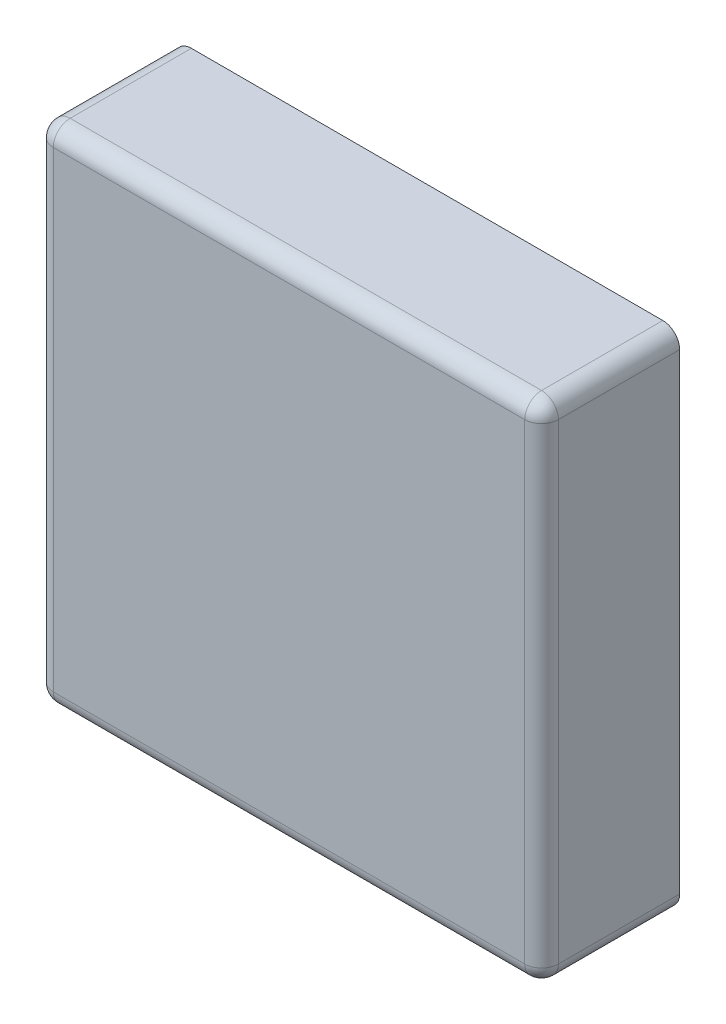
ISO-10303-21;
HEADER;
FILE_DESCRIPTION(('STEP AP214'),'2;1');
FILE_NAME('part.step','',(''),(''),'','','');
FILE_SCHEMA(('AUTOMOTIVE_DESIGN { 1 0 10303 214 1 1 1 1 }'));
ENDSEC;
DATA;
#1=APPLICATION_CONTEXT('core data for automotive mechanical design processes');
#2=APPLICATION_PROTOCOL_DEFINITION('international standard','automotive_design',2000,#1);
#3=PRODUCT_CONTEXT('',#1,'mechanical');
#4=PRODUCT('Part','Part','',(#3));
#5=PRODUCT_RELATED_PRODUCT_CATEGORY('part','',(#4));
#6=PRODUCT_DEFINITION_FORMATION('','',#4);
#7=PRODUCT_DEFINITION_CONTEXT('part definition',#1,'design');
#8=PRODUCT_DEFINITION('design','',#6,#7);
#9=PRODUCT_DEFINITION_SHAPE('','',#8);
#10=(LENGTH_UNIT() NAMED_UNIT(*) SI_UNIT(.MILLI.,.METRE.));
#11=(NAMED_UNIT(*) PLANE_ANGLE_UNIT() SI_UNIT($,.RADIAN.));
#12=(NAMED_UNIT(*) SI_UNIT($,.STERADIAN.) SOLID_ANGLE_UNIT());
#13=UNCERTAINTY_MEASURE_WITH_UNIT(LENGTH_MEASURE(1.E-05),#10,'distance_accuracy_value','');
#14=(GEOMETRIC_REPRESENTATION_CONTEXT(3) GLOBAL_UNCERTAINTY_ASSIGNED_CONTEXT((#13)) GLOBAL_UNIT_ASSIGNED_CONTEXT((#10,
#11,#12)) REPRESENTATION_CONTEXT('',''));
#15=CARTESIAN_POINT('',(0.,0.,0.));
#16=DIRECTION('',(0.,0.,1.));
#17=DIRECTION('',(1.,0.,0.));
#18=AXIS2_PLACEMENT_3D('',#15,#16,#17);
#19=CARTESIAN_POINT('',(-1.5,-1.5,0.));
#20=DIRECTION('',(0.,-1.,0.));
#21=DIRECTION('',(0.,0.,-1.));
#22=AXIS2_PLACEMENT_3D('',#19,#20,#21);
#23=PLANE('',#22);
#24=DIRECTION('',(0.,0.,1.));
#25=VECTOR('',#24,1.);
#26=CARTESIAN_POINT('',(-1.4,-1.5,0.));
#27=LINE('',#26,#25);
#28=CARTESIAN_POINT('',(-1.4,-1.5,0.));
#29=VERTEX_POINT('',#28);
#30=CARTESIAN_POINT('',(-1.4,-1.5,0.72));
#31=VERTEX_POINT('',#30);
#32=EDGE_CURVE('E141',#29,#31,#27,.T.);
#33=ORIENTED_EDGE('',*,*,#32,.F.);
#34=DIRECTION('',(1.,0.,0.));
#35=VECTOR('',#34,1.);
#36=CARTESIAN_POINT('',(-1.5,-1.5,0.));
#37=LINE('',#36,#35);
#38=CARTESIAN_POINT('',(1.4,-1.5,0.));
#39=VERTEX_POINT('',#38);
#40=EDGE_CURVE('E11',#29,#39,#37,.T.);
#41=ORIENTED_EDGE('',*,*,#40,.T.);
#42=DIRECTION('',(0.,0.,-1.));
#43=VECTOR('',#42,1.);
#44=CARTESIAN_POINT('',(1.4,-1.5,0.));
#45=LINE('',#44,#43);
#46=CARTESIAN_POINT('',(1.4,-1.5,0.72));
#47=VERTEX_POINT('',#46);
#48=EDGE_CURVE('E190',#47,#39,#45,.T.);
#49=ORIENTED_EDGE('',*,*,#48,.F.);
#50=DIRECTION('',(1.,0.,0.));
#51=VECTOR('',#50,1.);
#52=CARTESIAN_POINT('',(-0.75,-1.5,0.72));
#53=LINE('',#52,#51);
#54=EDGE_CURVE('E168',#31,#47,#53,.T.);
#55=ORIENTED_EDGE('',*,*,#54,.F.);
#56=EDGE_LOOP('',(#33,#41,#49,#55));
#57=FACE_BOUND('',#56,.T.);
#58=ADVANCED_FACE('F16',(#57),#23,.T.);
#59=CARTESIAN_POINT('',(1.5,-1.5,0.));
#60=DIRECTION('',(1.,0.,0.));
#61=DIRECTION('',(0.,1.,0.));
#62=AXIS2_PLACEMENT_3D('',#59,#60,#61);
#63=PLANE('',#62);
#64=DIRECTION('',(0.,0.,1.));
#65=VECTOR('',#64,1.);
#66=CARTESIAN_POINT('',(1.5,-1.4,0.));
#67=LINE('',#66,#65);
#68=CARTESIAN_POINT('',(1.5,-1.4,0.));
#69=VERTEX_POINT('',#68);
#70=CARTESIAN_POINT('',(1.5,-1.4,0.72));
#71=VERTEX_POINT('',#70);
#72=EDGE_CURVE('E186',#69,#71,#67,.T.);
#73=ORIENTED_EDGE('',*,*,#72,.F.);
#74=DIRECTION('',(0.,1.,0.));
#75=VECTOR('',#74,1.);
#76=CARTESIAN_POINT('',(1.5,-1.5,0.));
#77=LINE('',#76,#75);
#78=CARTESIAN_POINT('',(1.5,1.4,0.));
#79=VERTEX_POINT('',#78);
#80=EDGE_CURVE('E27',#69,#79,#77,.T.);
#81=ORIENTED_EDGE('',*,*,#80,.T.);
#82=DIRECTION('',(0.,0.,-1.));
#83=VECTOR('',#82,1.);
#84=CARTESIAN_POINT('',(1.5,1.4,0.));
#85=LINE('',#84,#83);
#86=CARTESIAN_POINT('',(1.5,1.4,0.72));
#87=VERTEX_POINT('',#86);
#88=EDGE_CURVE('E197',#87,#79,#85,.T.);
#89=ORIENTED_EDGE('',*,*,#88,.F.);
#90=DIRECTION('',(0.,1.,0.));
#91=VECTOR('',#90,1.);
#92=CARTESIAN_POINT('',(1.5,-0.75,0.72));
#93=LINE('',#92,#91);
#94=EDGE_CURVE('E249',#71,#87,#93,.T.);
#95=ORIENTED_EDGE('',*,*,#94,.F.);
#96=EDGE_LOOP('',(#73,#81,#89,#95));
#97=FACE_BOUND('',#96,.T.);
#98=ADVANCED_FACE('F356',(#97),#63,.T.);
#99=CARTESIAN_POINT('',(0.,0.,0.82));
#100=DIRECTION('',(0.,0.,1.));
#101=DIRECTION('',(1.,0.,0.));
#102=AXIS2_PLACEMENT_3D('',#99,#100,#101);
#103=PLANE('',#102);
#104=DIRECTION('',(0.,1.,0.));
#105=VECTOR('',#104,1.);
#106=CARTESIAN_POINT('',(-1.4,0.75,0.82));
#107=LINE('',#106,#105);
#108=CARTESIAN_POINT('',(-1.4,-1.4,0.82));
#109=VERTEX_POINT('',#108);
#110=CARTESIAN_POINT('',(-1.4,1.4,0.82));
#111=VERTEX_POINT('',#110);
#112=EDGE_CURVE('E129',#109,#111,#107,.T.);
#113=ORIENTED_EDGE('',*,*,#112,.F.);
#114=DIRECTION('',(-1.,0.,0.));
#115=VECTOR('',#114,1.);
#116=CARTESIAN_POINT('',(-0.75,-1.4,0.82));
#117=LINE('',#116,#115);
#118=CARTESIAN_POINT('',(1.4,-1.4,0.82));
#119=VERTEX_POINT('',#118);
#120=EDGE_CURVE('E171',#119,#109,#117,.T.);
#121=ORIENTED_EDGE('',*,*,#120,.F.);
#122=DIRECTION('',(0.,-1.,0.));
#123=VECTOR('',#122,1.);
#124=CARTESIAN_POINT('',(1.4,-0.75,0.82));
#125=LINE('',#124,#123);
#126=CARTESIAN_POINT('',(1.4,1.4,0.82));
#127=VERTEX_POINT('',#126);
#128=EDGE_CURVE('E20',#127,#119,#125,.T.);
#129=ORIENTED_EDGE('',*,*,#128,.F.);
#130=DIRECTION('',(1.,0.,0.));
#131=VECTOR('',#130,1.);
#132=CARTESIAN_POINT('',(0.75,1.4,0.82));
#133=LINE('',#132,#131);
#134=EDGE_CURVE('E201',#111,#127,#133,.T.);
#135=ORIENTED_EDGE('',*,*,#134,.F.);
#136=EDGE_LOOP('',(#113,#121,#129,#135));
#137=FACE_BOUND('',#136,.T.);
#138=ADVANCED_FACE('F351',(#137),#103,.T.);
#139=CARTESIAN_POINT('',(0.,0.,0.));
#140=DIRECTION('',(0.,0.,1.));
#141=DIRECTION('',(1.,0.,0.));
#142=AXIS2_PLACEMENT_3D('',#139,#140,#141);
#143=PLANE('',#142);
#144=CARTESIAN_POINT('',(-1.4,-1.4,0.));
#145=DIRECTION('',(0.,0.,1.));
#146=DIRECTION('',(-0.707106781186548,-0.707106781186548,0.));
#147=AXIS2_PLACEMENT_3D('',#144,#145,#146);
#148=CIRCLE('',#147,0.1);
#149=CARTESIAN_POINT('',(-1.5,-1.4,0.));
#150=VERTEX_POINT('',#149);
#151=EDGE_CURVE('E193',#150,#29,#148,.T.);
#152=ORIENTED_EDGE('',*,*,#151,.F.);
#153=DIRECTION('',(0.,-1.,0.));
#154=VECTOR('',#153,1.);
#155=CARTESIAN_POINT('',(-1.5,1.5,0.));
#156=LINE('',#155,#154);
#157=CARTESIAN_POINT('',(-1.5,1.4,0.));
#158=VERTEX_POINT('',#157);
#159=EDGE_CURVE('E135',#158,#150,#156,.T.);
#160=ORIENTED_EDGE('',*,*,#159,.F.);
#161=CARTESIAN_POINT('',(-1.4,1.4,0.));
#162=DIRECTION('',(0.,0.,1.));
#163=DIRECTION('',(-0.707106781186548,0.707106781186548,0.));
#164=AXIS2_PLACEMENT_3D('',#161,#162,#163);
#165=CIRCLE('',#164,0.1);
#166=CARTESIAN_POINT('',(-1.4,1.5,0.));
#167=VERTEX_POINT('',#166);
#168=EDGE_CURVE('E211',#167,#158,#165,.T.);
#169=ORIENTED_EDGE('',*,*,#168,.F.);
#170=DIRECTION('',(-1.,0.,0.));
#171=VECTOR('',#170,1.);
#172=CARTESIAN_POINT('',(1.5,1.5,0.));
#173=LINE('',#172,#171);
#174=CARTESIAN_POINT('',(1.4,1.5,0.));
#175=VERTEX_POINT('',#174);
#176=EDGE_CURVE('E41',#175,#167,#173,.T.);
#177=ORIENTED_EDGE('',*,*,#176,.F.);
#178=CARTESIAN_POINT('',(1.4,1.4,0.));
#179=DIRECTION('',(0.,0.,1.));
#180=DIRECTION('',(0.707106781186548,0.707106781186548,0.));
#181=AXIS2_PLACEMENT_3D('',#178,#179,#180);
#182=CIRCLE('',#181,0.1);
#183=EDGE_CURVE('E162',#79,#175,#182,.T.);
#184=ORIENTED_EDGE('',*,*,#183,.F.);
#185=ORIENTED_EDGE('',*,*,#80,.F.);
#186=CARTESIAN_POINT('',(1.4,-1.4,0.));
#187=DIRECTION('',(0.,0.,1.));
#188=DIRECTION('',(0.707106781186548,-0.707106781186548,0.));
#189=AXIS2_PLACEMENT_3D('',#186,#187,#188);
#190=CIRCLE('',#189,0.1);
#191=EDGE_CURVE('E179',#39,#69,#190,.T.);
#192=ORIENTED_EDGE('',*,*,#191,.F.);
#193=ORIENTED_EDGE('',*,*,#40,.F.);
#194=EDGE_LOOP('',(#152,#160,#169,#177,#184,#185,#192,#193));
#195=FACE_BOUND('',#194,.T.);
#196=ADVANCED_FACE('F304',(#195),#143,.F.);
#197=CARTESIAN_POINT('',(1.5,1.5,0.));
#198=DIRECTION('',(0.,1.,0.));
#199=DIRECTION('',(1.,0.,0.));
#200=AXIS2_PLACEMENT_3D('',#197,#198,#199);
#201=PLANE('',#200);
#202=DIRECTION('',(0.,0.,-1.));
#203=VECTOR('',#202,1.);
#204=CARTESIAN_POINT('',(-1.4,1.5,0.));
#205=LINE('',#204,#203);
#206=CARTESIAN_POINT('',(-1.4,1.5,0.72));
#207=VERTEX_POINT('',#206);
#208=EDGE_CURVE('E173',#207,#167,#205,.T.);
#209=ORIENTED_EDGE('',*,*,#208,.F.);
#210=DIRECTION('',(-1.,0.,0.));
#211=VECTOR('',#210,1.);
#212=CARTESIAN_POINT('',(0.75,1.5,0.72));
#213=LINE('',#212,#211);
#214=CARTESIAN_POINT('',(1.4,1.5,0.72));
#215=VERTEX_POINT('',#214);
#216=EDGE_CURVE('E198',#215,#207,#213,.T.);
#217=ORIENTED_EDGE('',*,*,#216,.F.);
#218=DIRECTION('',(0.,0.,1.));
#219=VECTOR('',#218,1.);
#220=CARTESIAN_POINT('',(1.4,1.5,0.));
#221=LINE('',#220,#219);
#222=EDGE_CURVE('E166',#175,#215,#221,.T.);
#223=ORIENTED_EDGE('',*,*,#222,.F.);
#224=ORIENTED_EDGE('',*,*,#176,.T.);
#225=EDGE_LOOP('',(#209,#217,#223,#224));
#226=FACE_BOUND('',#225,.T.);
#227=ADVANCED_FACE('F301',(#226),#201,.T.);
#228=CARTESIAN_POINT('',(-1.5,1.5,0.));
#229=DIRECTION('',(-1.,0.,0.));
#230=DIRECTION('',(0.,0.,1.));
#231=AXIS2_PLACEMENT_3D('',#228,#229,#230);
#232=PLANE('',#231);
#233=DIRECTION('',(0.,0.,-1.));
#234=VECTOR('',#233,1.);
#235=CARTESIAN_POINT('',(-1.5,-1.4,0.));
#236=LINE('',#235,#234);
#237=CARTESIAN_POINT('',(-1.5,-1.4,0.72));
#238=VERTEX_POINT('',#237);
#239=EDGE_CURVE('E132',#238,#150,#236,.T.);
#240=ORIENTED_EDGE('',*,*,#239,.F.);
#241=DIRECTION('',(0.,-1.,0.));
#242=VECTOR('',#241,1.);
#243=CARTESIAN_POINT('',(-1.5,0.75,0.72));
#244=LINE('',#243,#242);
#245=CARTESIAN_POINT('',(-1.5,1.4,0.72));
#246=VERTEX_POINT('',#245);
#247=EDGE_CURVE('E115',#246,#238,#244,.T.);
#248=ORIENTED_EDGE('',*,*,#247,.F.);
#249=DIRECTION('',(0.,0.,1.));
#250=VECTOR('',#249,1.);
#251=CARTESIAN_POINT('',(-1.5,1.4,0.));
#252=LINE('',#251,#250);
#253=EDGE_CURVE('E208',#158,#246,#252,.T.);
#254=ORIENTED_EDGE('',*,*,#253,.F.);
#255=ORIENTED_EDGE('',*,*,#159,.T.);
#256=EDGE_LOOP('',(#240,#248,#254,#255));
#257=FACE_BOUND('',#256,.T.);
#258=ADVANCED_FACE('F134',(#257),#232,.T.);
#259=CARTESIAN_POINT('',(-0.75,-1.4,0.72));
#260=DIRECTION('',(1.,0.,0.));
#261=DIRECTION('',(0.,-0.707106781186548,0.707106781186548));
#262=AXIS2_PLACEMENT_3D('',#259,#260,#261);
#263=CYLINDRICAL_SURFACE('',#262,0.1);
#264=CARTESIAN_POINT('',(1.4,-1.4,0.72));
#265=DIRECTION('',(1.,0.,0.));
#266=DIRECTION('',(0.,-1.,0.));
#267=AXIS2_PLACEMENT_3D('',#264,#265,#266);
#268=CIRCLE('',#267,0.1);
#269=EDGE_CURVE('E128',#119,#47,#268,.T.);
#270=ORIENTED_EDGE('',*,*,#269,.F.);
#271=ORIENTED_EDGE('',*,*,#120,.T.);
#272=CARTESIAN_POINT('',(-1.4,-1.4,0.72));
#273=DIRECTION('',(-1.,0.,0.));
#274=DIRECTION('',(0.,0.,1.));
#275=AXIS2_PLACEMENT_3D('',#272,#273,#274);
#276=CIRCLE('',#275,0.1);
#277=EDGE_CURVE('E152',#31,#109,#276,.T.);
#278=ORIENTED_EDGE('',*,*,#277,.F.);
#279=ORIENTED_EDGE('',*,*,#54,.T.);
#280=EDGE_LOOP('',(#270,#271,#278,#279));
#281=FACE_BOUND('',#280,.T.);
#282=ADVANCED_FACE('F270',(#281),#263,.T.);
#283=CARTESIAN_POINT('',(1.4,-0.75,0.72));
#284=DIRECTION('',(0.,1.,0.));
#285=DIRECTION('',(0.707106781186548,0.,0.707106781186548));
#286=AXIS2_PLACEMENT_3D('',#283,#284,#285);
#287=CYLINDRICAL_SURFACE('',#286,0.1);
#288=CARTESIAN_POINT('',(1.4,1.4,0.72));
#289=DIRECTION('',(0.,1.,0.));
#290=DIRECTION('',(1.,0.,0.));
#291=AXIS2_PLACEMENT_3D('',#288,#289,#290);
#292=CIRCLE('',#291,0.1);
#293=EDGE_CURVE('E185',#127,#87,#292,.T.);
#294=ORIENTED_EDGE('',*,*,#293,.F.);
#295=ORIENTED_EDGE('',*,*,#128,.T.);
#296=CARTESIAN_POINT('',(1.4,-1.4,0.72));
#297=DIRECTION('',(0.,-1.,0.));
#298=DIRECTION('',(0.,0.,1.));
#299=AXIS2_PLACEMENT_3D('',#296,#297,#298);
#300=CIRCLE('',#299,0.1);
#301=EDGE_CURVE('E175',#71,#119,#300,.T.);
#302=ORIENTED_EDGE('',*,*,#301,.F.);
#303=ORIENTED_EDGE('',*,*,#94,.T.);
#304=EDGE_LOOP('',(#294,#295,#302,#303));
#305=FACE_BOUND('',#304,.T.);
#306=ADVANCED_FACE('F18',(#305),#287,.T.);
#307=CARTESIAN_POINT('',(0.75,1.4,0.72));
#308=DIRECTION('',(-1.,0.,0.));
#309=DIRECTION('',(0.,0.707106781186548,0.707106781186548));
#310=AXIS2_PLACEMENT_3D('',#307,#308,#309);
#311=CYLINDRICAL_SURFACE('',#310,0.1);
#312=CARTESIAN_POINT('',(-1.4,1.4,0.72));
#313=DIRECTION('',(-1.,0.,0.));
#314=DIRECTION('',(0.,1.,0.));
#315=AXIS2_PLACEMENT_3D('',#312,#313,#314);
#316=CIRCLE('',#315,0.1);
#317=EDGE_CURVE('E140',#111,#207,#316,.T.);
#318=ORIENTED_EDGE('',*,*,#317,.F.);
#319=ORIENTED_EDGE('',*,*,#134,.T.);
#320=CARTESIAN_POINT('',(1.4,1.4,0.72));
#321=DIRECTION('',(1.,0.,0.));
#322=DIRECTION('',(0.,0.,1.));
#323=AXIS2_PLACEMENT_3D('',#320,#321,#322);
#324=CIRCLE('',#323,0.1);
#325=EDGE_CURVE('E167',#215,#127,#324,.T.);
#326=ORIENTED_EDGE('',*,*,#325,.F.);
#327=ORIENTED_EDGE('',*,*,#216,.T.);
#328=EDGE_LOOP('',(#318,#319,#326,#327));
#329=FACE_BOUND('',#328,.T.);
#330=ADVANCED_FACE('F293',(#329),#311,.T.);
#331=CARTESIAN_POINT('',(1.4,1.4,0.));
#332=DIRECTION('',(0.,0.,1.));
#333=DIRECTION('',(0.707106781186548,0.707106781186548,0.));
#334=AXIS2_PLACEMENT_3D('',#331,#332,#333);
#335=CYLINDRICAL_SURFACE('',#334,0.1);
#336=ORIENTED_EDGE('',*,*,#183,.T.);
#337=ORIENTED_EDGE('',*,*,#222,.T.);
#338=CARTESIAN_POINT('',(1.4,1.4,0.72));
#339=DIRECTION('',(0.,0.,1.));
#340=DIRECTION('',(0.,1.,0.));
#341=AXIS2_PLACEMENT_3D('',#338,#339,#340);
#342=CIRCLE('',#341,0.1);
#343=EDGE_CURVE('E181',#87,#215,#342,.T.);
#344=ORIENTED_EDGE('',*,*,#343,.F.);
#345=ORIENTED_EDGE('',*,*,#88,.T.);
#346=EDGE_LOOP('',(#336,#337,#344,#345));
#347=FACE_BOUND('',#346,.T.);
#348=ADVANCED_FACE('F298',(#347),#335,.T.);
#349=CARTESIAN_POINT('',(1.4,1.4,0.72));
#350=DIRECTION('',(0.408248290463863,0.408248290463863,-0.816496580927726));
#351=DIRECTION('',(0.577350269189626,0.577350269189626,0.577350269189626));
#352=AXIS2_PLACEMENT_3D('',#349,#350,#351);
#353=SPHERICAL_SURFACE('',#352,0.1);
#354=ORIENTED_EDGE('',*,*,#293,.T.);
#355=ORIENTED_EDGE('',*,*,#343,.T.);
#356=ORIENTED_EDGE('',*,*,#325,.T.);
#357=EDGE_LOOP('',(#354,#355,#356));
#358=FACE_BOUND('',#357,.T.);
#359=ADVANCED_FACE('F295',(#358),#353,.T.);
#360=CARTESIAN_POINT('',(1.4,-1.4,0.));
#361=DIRECTION('',(0.,0.,1.));
#362=DIRECTION('',(0.707106781186548,-0.707106781186548,0.));
#363=AXIS2_PLACEMENT_3D('',#360,#361,#362);
#364=CYLINDRICAL_SURFACE('',#363,0.1);
#365=ORIENTED_EDGE('',*,*,#191,.T.);
#366=ORIENTED_EDGE('',*,*,#72,.T.);
#367=CARTESIAN_POINT('',(1.4,-1.4,0.72));
#368=DIRECTION('',(0.,0.,1.));
#369=DIRECTION('',(1.,0.,0.));
#370=AXIS2_PLACEMENT_3D('',#367,#368,#369);
#371=CIRCLE('',#370,0.1);
#372=EDGE_CURVE('E180',#47,#71,#371,.T.);
#373=ORIENTED_EDGE('',*,*,#372,.F.);
#374=ORIENTED_EDGE('',*,*,#48,.T.);
#375=EDGE_LOOP('',(#365,#366,#373,#374));
#376=FACE_BOUND('',#375,.T.);
#377=ADVANCED_FACE('F277',(#376),#364,.T.);
#378=CARTESIAN_POINT('',(1.4,-1.4,0.72));
#379=DIRECTION('',(-0.816496580927726,-0.408248290463863,0.408248290463863));
#380=DIRECTION('',(0.577350269189626,-0.577350269189626,0.577350269189626));
#381=AXIS2_PLACEMENT_3D('',#378,#379,#380);
#382=SPHERICAL_SURFACE('',#381,0.1);
#383=ORIENTED_EDGE('',*,*,#269,.T.);
#384=ORIENTED_EDGE('',*,*,#372,.T.);
#385=ORIENTED_EDGE('',*,*,#301,.T.);
#386=EDGE_LOOP('',(#383,#384,#385));
#387=FACE_BOUND('',#386,.T.);
#388=ADVANCED_FACE('F267',(#387),#382,.T.);
#389=CARTESIAN_POINT('',(-1.4,0.75,0.72));
#390=DIRECTION('',(0.,-1.,0.));
#391=DIRECTION('',(-0.707106781186548,0.,0.707106781186548));
#392=AXIS2_PLACEMENT_3D('',#389,#390,#391);
#393=CYLINDRICAL_SURFACE('',#392,0.1);
#394=CARTESIAN_POINT('',(-1.4,-1.4,0.72));
#395=DIRECTION('',(0.,-1.,0.));
#396=DIRECTION('',(-1.,0.,0.));
#397=AXIS2_PLACEMENT_3D('',#394,#395,#396);
#398=CIRCLE('',#397,0.1);
#399=EDGE_CURVE('E120',#109,#238,#398,.T.);
#400=ORIENTED_EDGE('',*,*,#399,.F.);
#401=ORIENTED_EDGE('',*,*,#112,.T.);
#402=CARTESIAN_POINT('',(-1.4,1.4,0.72));
#403=DIRECTION('',(0.,1.,0.));
#404=DIRECTION('',(0.,0.,1.));
#405=AXIS2_PLACEMENT_3D('',#402,#403,#404);
#406=CIRCLE('',#405,0.1);
#407=EDGE_CURVE('E122',#246,#111,#406,.T.);
#408=ORIENTED_EDGE('',*,*,#407,.F.);
#409=ORIENTED_EDGE('',*,*,#247,.T.);
#410=EDGE_LOOP('',(#400,#401,#408,#409));
#411=FACE_BOUND('',#410,.T.);
#412=ADVANCED_FACE('F117',(#411),#393,.T.);
#413=CARTESIAN_POINT('',(-1.4,1.4,0.));
#414=DIRECTION('',(0.,0.,1.));
#415=DIRECTION('',(-0.707106781186548,0.707106781186548,0.));
#416=AXIS2_PLACEMENT_3D('',#413,#414,#415);
#417=CYLINDRICAL_SURFACE('',#416,0.1);
#418=ORIENTED_EDGE('',*,*,#168,.T.);
#419=ORIENTED_EDGE('',*,*,#253,.T.);
#420=CARTESIAN_POINT('',(-1.4,1.4,0.72));
#421=DIRECTION('',(0.,0.,1.));
#422=DIRECTION('',(-1.,0.,0.));
#423=AXIS2_PLACEMENT_3D('',#420,#421,#422);
#424=CIRCLE('',#423,0.1);
#425=EDGE_CURVE('E214',#207,#246,#424,.T.);
#426=ORIENTED_EDGE('',*,*,#425,.F.);
#427=ORIENTED_EDGE('',*,*,#208,.T.);
#428=EDGE_LOOP('',(#418,#419,#426,#427));
#429=FACE_BOUND('',#428,.T.);
#430=ADVANCED_FACE('F303',(#429),#417,.T.);
#431=CARTESIAN_POINT('',(-1.4,1.4,0.72));
#432=DIRECTION('',(-0.408248290463863,0.408248290463863,-0.816496580927726));
#433=DIRECTION('',(-0.577350269189626,0.577350269189626,0.577350269189626));
#434=AXIS2_PLACEMENT_3D('',#431,#432,#433);
#435=SPHERICAL_SURFACE('',#434,0.1);
#436=ORIENTED_EDGE('',*,*,#317,.T.);
#437=ORIENTED_EDGE('',*,*,#425,.T.);
#438=ORIENTED_EDGE('',*,*,#407,.T.);
#439=EDGE_LOOP('',(#436,#437,#438));
#440=FACE_BOUND('',#439,.T.);
#441=ADVANCED_FACE('F395',(#440),#435,.T.);
#442=CARTESIAN_POINT('',(-1.4,-1.4,0.));
#443=DIRECTION('',(0.,0.,1.));
#444=DIRECTION('',(-0.707106781186548,-0.707106781186548,0.));
#445=AXIS2_PLACEMENT_3D('',#442,#443,#444);
#446=CYLINDRICAL_SURFACE('',#445,0.1);
#447=ORIENTED_EDGE('',*,*,#151,.T.);
#448=ORIENTED_EDGE('',*,*,#32,.T.);
#449=CARTESIAN_POINT('',(-1.4,-1.4,0.72));
#450=DIRECTION('',(0.,0.,1.));
#451=DIRECTION('',(0.,-1.,0.));
#452=AXIS2_PLACEMENT_3D('',#449,#450,#451);
#453=CIRCLE('',#452,0.1);
#454=EDGE_CURVE('E145',#238,#31,#453,.T.);
#455=ORIENTED_EDGE('',*,*,#454,.F.);
#456=ORIENTED_EDGE('',*,*,#239,.T.);
#457=EDGE_LOOP('',(#447,#448,#455,#456));
#458=FACE_BOUND('',#457,.T.);
#459=ADVANCED_FACE('F146',(#458),#446,.T.);
#460=CARTESIAN_POINT('',(-1.4,-1.4,0.72));
#461=DIRECTION('',(-0.408248290463863,-0.408248290463863,-0.816496580927726));
#462=DIRECTION('',(-0.577350269189626,-0.577350269189626,0.577350269189626));
#463=AXIS2_PLACEMENT_3D('',#460,#461,#462);
#464=SPHERICAL_SURFACE('',#463,0.1);
#465=ORIENTED_EDGE('',*,*,#399,.T.);
#466=ORIENTED_EDGE('',*,*,#454,.T.);
#467=ORIENTED_EDGE('',*,*,#277,.T.);
#468=EDGE_LOOP('',(#465,#466,#467));
#469=FACE_BOUND('',#468,.T.);
#470=ADVANCED_FACE('F153',(#469),#464,.T.);
#471=CLOSED_SHELL('',(#58,#98,#138,#196,#227,#258,#282,#306,#330,#348,#359,#377,#388,#412,#430,
#441,#459,#470));
#472=MANIFOLD_SOLID_BREP('B1',#471);
#473=ADVANCED_BREP_SHAPE_REPRESENTATION('',(#18,#472),#14);
#474=SHAPE_DEFINITION_REPRESENTATION(#9,#473);
ENDSEC;
END-ISO-10303-21;
